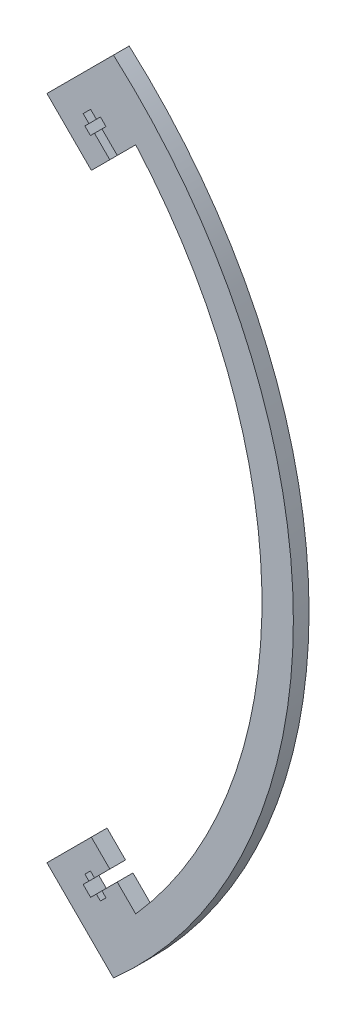
ISO-10303-21;
HEADER;
FILE_DESCRIPTION(('STEP AP214'),'2;1');
FILE_NAME('part.step','',(''),(''),'','','');
FILE_SCHEMA(('AUTOMOTIVE_DESIGN { 1 0 10303 214 1 1 1 1 }'));
ENDSEC;
DATA;
#1=APPLICATION_CONTEXT('core data for automotive mechanical design processes');
#2=APPLICATION_PROTOCOL_DEFINITION('international standard','automotive_design',2000,#1);
#3=PRODUCT_CONTEXT('',#1,'mechanical');
#4=PRODUCT('Part','Part','',(#3));
#5=PRODUCT_RELATED_PRODUCT_CATEGORY('part','',(#4));
#6=PRODUCT_DEFINITION_FORMATION('','',#4);
#7=PRODUCT_DEFINITION_CONTEXT('part definition',#1,'design');
#8=PRODUCT_DEFINITION('design','',#6,#7);
#9=PRODUCT_DEFINITION_SHAPE('','',#8);
#10=(LENGTH_UNIT() NAMED_UNIT(*) SI_UNIT(.MILLI.,.METRE.));
#11=(NAMED_UNIT(*) PLANE_ANGLE_UNIT() SI_UNIT($,.RADIAN.));
#12=(NAMED_UNIT(*) SI_UNIT($,.STERADIAN.) SOLID_ANGLE_UNIT());
#13=UNCERTAINTY_MEASURE_WITH_UNIT(LENGTH_MEASURE(1.E-05),#10,'distance_accuracy_value','');
#14=(GEOMETRIC_REPRESENTATION_CONTEXT(3) GLOBAL_UNCERTAINTY_ASSIGNED_CONTEXT((#13)) GLOBAL_UNIT_ASSIGNED_CONTEXT((#10,
#11,#12)) REPRESENTATION_CONTEXT('',''));
#15=CARTESIAN_POINT('',(0.,0.,0.));
#16=DIRECTION('',(0.,0.,1.));
#17=DIRECTION('',(1.,0.,0.));
#18=AXIS2_PLACEMENT_3D('',#15,#16,#17);
#19=CARTESIAN_POINT('',(-13.2205464738355,-30.6813833004375,-66.4915305198155));
#20=DIRECTION('',(-0.707106781186552,0.707106781186543,0.));
#21=DIRECTION('',(-0.707106781186543,-0.707106781186552,0.));
#22=AXIS2_PLACEMENT_3D('',#19,#20,#21);
#23=PLANE('',#22);
#24=DIRECTION('',(0.,0.,1.));
#25=VECTOR('',#24,1.);
#26=CARTESIAN_POINT('',(122.73431920871,105.273482382109,0.));
#27=LINE('',#26,#25);
#28=CARTESIAN_POINT('',(122.73431920871,105.273482382109,0.));
#29=VERTEX_POINT('',#28);
#30=CARTESIAN_POINT('',(122.73431920871,105.273482382109,6.35));
#31=VERTEX_POINT('',#30);
#32=EDGE_CURVE('E261',#29,#31,#27,.T.);
#33=ORIENTED_EDGE('',*,*,#32,.F.);
#34=DIRECTION('',(-0.707106781186543,-0.707106781186552,0.));
#35=VECTOR('',#34,1.);
#36=CARTESIAN_POINT('',(-13.2205464738355,-30.6813833004375,0.));
#37=LINE('',#36,#35);
#38=CARTESIAN_POINT('',(130.198070847377,112.737234020776,0.));
#39=VERTEX_POINT('',#38);
#40=EDGE_CURVE('E267',#39,#29,#37,.T.);
#41=ORIENTED_EDGE('',*,*,#40,.F.);
#42=DIRECTION('',(0.,0.,1.));
#43=VECTOR('',#42,1.);
#44=CARTESIAN_POINT('',(130.198070847377,112.737234020777,-66.4915305198155));
#45=LINE('',#44,#43);
#46=CARTESIAN_POINT('',(130.198070847377,112.737234020777,6.35));
#47=VERTEX_POINT('',#46);
#48=EDGE_CURVE('E350',#39,#47,#45,.T.);
#49=ORIENTED_EDGE('',*,*,#48,.T.);
#50=DIRECTION('',(-0.707106781186543,-0.707106781186552,0.));
#51=VECTOR('',#50,1.);
#52=CARTESIAN_POINT('',(-13.2205464738355,-30.6813833004375,6.35));
#53=LINE('',#52,#51);
#54=EDGE_CURVE('E342',#47,#31,#53,.T.);
#55=ORIENTED_EDGE('',*,*,#54,.T.);
#56=EDGE_LOOP('',(#33,#41,#49,#55));
#57=FACE_BOUND('',#56,.T.);
#58=ADVANCED_FACE('F35',(#57),#23,.F.);
#59=CARTESIAN_POINT('',(-13.2205464738356,-13.2205464738356,-66.4915305198155));
#60=DIRECTION('',(0.707106781186547,0.707106781186547,0.));
#61=DIRECTION('',(-0.707106781186548,0.707106781186548,0.));
#62=AXIS2_PLACEMENT_3D('',#59,#60,#61);
#63=PLANE('',#62);
#64=DIRECTION('',(-0.707106781186548,0.707106781186548,0.));
#65=VECTOR('',#64,1.);
#66=CARTESIAN_POINT('',(-13.2205464738356,-13.2205464738356,6.35));
#67=LINE('',#66,#65);
#68=CARTESIAN_POINT('',(119.716953152031,-146.158046099702,6.35));
#69=VERTEX_POINT('',#68);
#70=CARTESIAN_POINT('',(112.253201513364,-138.694294461035,6.35));
#71=VERTEX_POINT('',#70);
#72=EDGE_CURVE('E432',#69,#71,#67,.T.);
#73=ORIENTED_EDGE('',*,*,#72,.F.);
#74=DIRECTION('',(0.,0.,1.));
#75=VECTOR('',#74,1.);
#76=CARTESIAN_POINT('',(119.716953152031,-146.158046099702,0.));
#77=LINE('',#76,#75);
#78=CARTESIAN_POINT('',(119.716953152031,-146.158046099702,0.));
#79=VERTEX_POINT('',#78);
#80=EDGE_CURVE('E398',#79,#69,#77,.T.);
#81=ORIENTED_EDGE('',*,*,#80,.F.);
#82=DIRECTION('',(-0.707106781186548,0.707106781186548,0.));
#83=VECTOR('',#82,1.);
#84=CARTESIAN_POINT('',(-13.2205464738356,-13.2205464738356,0.));
#85=LINE('',#84,#83);
#86=CARTESIAN_POINT('',(112.253201513364,-138.694294461035,0.));
#87=VERTEX_POINT('',#86);
#88=EDGE_CURVE('E476',#79,#87,#85,.T.);
#89=ORIENTED_EDGE('',*,*,#88,.T.);
#90=DIRECTION('',(0.,0.,1.));
#91=VECTOR('',#90,1.);
#92=CARTESIAN_POINT('',(112.253201513364,-138.694294461035,-66.4915305198155));
#93=LINE('',#92,#91);
#94=EDGE_CURVE('E472',#87,#71,#93,.T.);
#95=ORIENTED_EDGE('',*,*,#94,.T.);
#96=EDGE_LOOP('',(#73,#81,#89,#95));
#97=FACE_BOUND('',#96,.T.);
#98=ADVANCED_FACE('F568',(#97),#63,.T.);
#99=CARTESIAN_POINT('',(-21.9509648871366,-21.9509648871358,6.35));
#100=DIRECTION('',(0.,0.,-1.));
#101=DIRECTION('',(-1.,0.,0.));
#102=AXIS2_PLACEMENT_3D('',#99,#100,#101);
#103=CYLINDRICAL_SURFACE('',#102,215.9);
#104=CARTESIAN_POINT('',(-21.9509648871366,-21.9509648871358,0.));
#105=DIRECTION('',(0.,0.,1.));
#106=DIRECTION('',(-1.,0.,0.));
#107=AXIS2_PLACEMENT_3D('',#104,#105,#106);
#108=CIRCLE('',#107,215.9);
#109=CARTESIAN_POINT('',(121.204013938505,-183.566131370452,0.));
#110=VERTEX_POINT('',#109);
#111=CARTESIAN_POINT('',(121.204013938504,139.66420159618,0.));
#112=VERTEX_POINT('',#111);
#113=EDGE_CURVE('E479',#110,#112,#108,.T.);
#114=ORIENTED_EDGE('',*,*,#113,.T.);
#115=DIRECTION('',(0.,0.,1.));
#116=VECTOR('',#115,1.);
#117=CARTESIAN_POINT('',(121.204013938504,139.66420159618,-66.4915305198155));
#118=LINE('',#117,#116);
#119=CARTESIAN_POINT('',(121.204013938504,139.66420159618,6.35));
#120=VERTEX_POINT('',#119);
#121=EDGE_CURVE('E362',#112,#120,#118,.T.);
#122=ORIENTED_EDGE('',*,*,#121,.T.);
#123=CARTESIAN_POINT('',(-21.9509648871366,-21.9509648871358,6.35));
#124=DIRECTION('',(0.,0.,1.));
#125=DIRECTION('',(-1.,0.,0.));
#126=AXIS2_PLACEMENT_3D('',#123,#124,#125);
#127=CIRCLE('',#126,215.9);
#128=CARTESIAN_POINT('',(121.204013938505,-183.566131370452,6.35));
#129=VERTEX_POINT('',#128);
#130=EDGE_CURVE('E44',#129,#120,#127,.T.);
#131=ORIENTED_EDGE('',*,*,#130,.F.);
#132=DIRECTION('',(0.,0.,1.));
#133=VECTOR('',#132,1.);
#134=CARTESIAN_POINT('',(121.204013938505,-183.566131370452,-66.4915305198155));
#135=LINE('',#134,#133);
#136=EDGE_CURVE('E467',#110,#129,#135,.T.);
#137=ORIENTED_EDGE('',*,*,#136,.F.);
#138=EDGE_LOOP('',(#114,#122,#131,#137));
#139=FACE_BOUND('',#138,.T.);
#140=ADVANCED_FACE('F37',(#139),#103,.T.);
#141=CARTESIAN_POINT('',(-21.9509648871366,-21.9509648871358,6.35));
#142=DIRECTION('',(0.,0.,-1.));
#143=DIRECTION('',(-1.,0.,0.));
#144=AXIS2_PLACEMENT_3D('',#141,#142,#143);
#145=CYLINDRICAL_SURFACE('',#144,203.2);
#146=CARTESIAN_POINT('',(-21.9509648871366,-21.9509648871358,0.));
#147=DIRECTION('',(0.,0.,-1.));
#148=DIRECTION('',(-1.,0.,0.));
#149=AXIS2_PLACEMENT_3D('',#146,#147,#148);
#150=CIRCLE('',#149,203.2);
#151=CARTESIAN_POINT('',(130.198070847378,-156.639163795049,0.));
#152=VERTEX_POINT('',#151);
#153=EDGE_CURVE('E39',#39,#152,#150,.T.);
#154=ORIENTED_EDGE('',*,*,#153,.T.);
#155=DIRECTION('',(0.,0.,1.));
#156=VECTOR('',#155,1.);
#157=CARTESIAN_POINT('',(130.198070847378,-156.639163795049,-66.4915305198155));
#158=LINE('',#157,#156);
#159=CARTESIAN_POINT('',(130.198070847378,-156.639163795049,6.35));
#160=VERTEX_POINT('',#159);
#161=EDGE_CURVE('E457',#152,#160,#158,.T.);
#162=ORIENTED_EDGE('',*,*,#161,.T.);
#163=CARTESIAN_POINT('',(-21.9509648871366,-21.9509648871358,6.35));
#164=DIRECTION('',(0.,0.,-1.));
#165=DIRECTION('',(-1.,0.,0.));
#166=AXIS2_PLACEMENT_3D('',#163,#164,#165);
#167=CIRCLE('',#166,203.2);
#168=EDGE_CURVE('E11',#47,#160,#167,.T.);
#169=ORIENTED_EDGE('',*,*,#168,.F.);
#170=ORIENTED_EDGE('',*,*,#48,.F.);
#171=EDGE_LOOP('',(#154,#162,#169,#170));
#172=FACE_BOUND('',#171,.T.);
#173=ADVANCED_FACE('F490',(#172),#145,.F.);
#174=CARTESIAN_POINT('',(-21.9509648871366,-21.9509648871358,6.35));
#175=DIRECTION('',(0.,0.,-1.));
#176=DIRECTION('',(-1.,0.,0.));
#177=AXIS2_PLACEMENT_3D('',#174,#175,#176);
#178=PLANE('',#177);
#179=CARTESIAN_POINT('',(119.716953152031,102.25611632543,6.35));
#180=VERTEX_POINT('',#179);
#181=CARTESIAN_POINT('',(112.253201513363,94.792364686763,6.35));
#182=VERTEX_POINT('',#181);
#183=EDGE_CURVE('E346',#180,#182,#53,.T.);
#184=ORIENTED_EDGE('',*,*,#183,.F.);
#185=DIRECTION('',(0.707106781186552,-0.707106781186543,0.));
#186=VECTOR('',#185,1.);
#187=CARTESIAN_POINT('',(132.937499625866,89.0355698515946,6.35));
#188=LINE('',#187,#186);
#189=CARTESIAN_POINT('',(113.520576428493,108.452493048968,6.35));
#190=VERTEX_POINT('',#189);
#191=EDGE_CURVE('E268',#190,#180,#188,.T.);
#192=ORIENTED_EDGE('',*,*,#191,.F.);
#193=DIRECTION('',(0.707106781186543,0.707106781186552,0.));
#194=VECTOR('',#193,1.);
#195=CARTESIAN_POINT('',(-19.4169231973732,-24.4850065768999,6.35));
#196=LINE('',#195,#194);
#197=CARTESIAN_POINT('',(111.886169814458,106.818086434933,6.35));
#198=VERTEX_POINT('',#197);
#199=EDGE_CURVE('E270',#198,#190,#196,.T.);
#200=ORIENTED_EDGE('',*,*,#199,.F.);
#201=DIRECTION('',(0.707106781186552,-0.707106781186543,0.));
#202=VECTOR('',#201,1.);
#203=CARTESIAN_POINT('',(131.303093011832,87.40116323756,6.35));
#204=LINE('',#203,#202);
#205=CARTESIAN_POINT('',(109.641105784191,109.0631504652,6.35));
#206=VERTEX_POINT('',#205);
#207=EDGE_CURVE('E315',#206,#198,#204,.T.);
#208=ORIENTED_EDGE('',*,*,#207,.F.);
#209=DIRECTION('',(-0.707106781186543,-0.707106781186552,0.));
#210=VECTOR('',#209,1.);
#211=CARTESIAN_POINT('',(-21.6619872276405,-22.2399425466326,6.35));
#212=LINE('',#211,#210);
#213=CARTESIAN_POINT('',(111.275512398225,110.697557079235,6.35));
#214=VERTEX_POINT('',#213);
#215=EDGE_CURVE('E312',#214,#206,#212,.T.);
#216=ORIENTED_EDGE('',*,*,#215,.F.);
#217=DIRECTION('',(-0.707106781186552,0.707106781186543,0.));
#218=VECTOR('',#217,1.);
#219=CARTESIAN_POINT('',(132.937499625866,89.0355698515946,6.35));
#220=LINE('',#219,#218);
#221=CARTESIAN_POINT('',(108.940645806747,113.032423670713,6.35));
#222=VERTEX_POINT('',#221);
#223=EDGE_CURVE('E309',#214,#222,#220,.T.);
#224=ORIENTED_EDGE('',*,*,#223,.T.);
#225=DIRECTION('',(0.707106781186543,0.707106781186552,0.));
#226=VECTOR('',#225,1.);
#227=CARTESIAN_POINT('',(-23.9968538191185,-19.9050759551546,6.35));
#228=LINE('',#227,#226);
#229=CARTESIAN_POINT('',(111.958011863427,116.049789727392,6.35));
#230=VERTEX_POINT('',#229);
#231=EDGE_CURVE('E306',#222,#230,#228,.T.);
#232=ORIENTED_EDGE('',*,*,#231,.T.);
#233=DIRECTION('',(-0.707106781186552,0.707106781186543,0.));
#234=VECTOR('',#233,1.);
#235=CARTESIAN_POINT('',(135.954865682545,92.0529359082739,6.35));
#236=LINE('',#235,#234);
#237=CARTESIAN_POINT('',(114.292878454905,113.714923135914,6.35));
#238=VERTEX_POINT('',#237);
#239=EDGE_CURVE('E303',#238,#230,#236,.T.);
#240=ORIENTED_EDGE('',*,*,#239,.F.);
#241=DIRECTION('',(0.70710678118654,0.707106781186555,0.));
#242=VECTOR('',#241,1.);
#243=CARTESIAN_POINT('',(-21.66198722764,-22.2399425466332,6.35));
#244=LINE('',#243,#242);
#245=CARTESIAN_POINT('',(115.927285068939,115.349329749949,6.35));
#246=VERTEX_POINT('',#245);
#247=EDGE_CURVE('E300',#238,#246,#244,.T.);
#248=ORIENTED_EDGE('',*,*,#247,.T.);
#249=DIRECTION('',(0.707106781186545,-0.70710678118655,0.));
#250=VECTOR('',#249,1.);
#251=CARTESIAN_POINT('',(137.589272296581,93.687342522307,6.35));
#252=LINE('',#251,#250);
#253=CARTESIAN_POINT('',(118.172349099207,113.104265719682,6.35));
#254=VERTEX_POINT('',#253);
#255=EDGE_CURVE('E297',#246,#254,#252,.T.);
#256=ORIENTED_EDGE('',*,*,#255,.T.);
#257=DIRECTION('',(-0.707106781186543,-0.707106781186552,0.));
#258=VECTOR('',#257,1.);
#259=CARTESIAN_POINT('',(-19.4169231973732,-24.4850065768999,6.35));
#260=LINE('',#259,#258);
#261=CARTESIAN_POINT('',(116.537942485172,111.469859105647,6.35));
#262=VERTEX_POINT('',#261);
#263=EDGE_CURVE('E295',#254,#262,#260,.T.);
#264=ORIENTED_EDGE('',*,*,#263,.T.);
#265=DIRECTION('',(0.707106781186552,-0.707106781186543,0.));
#266=VECTOR('',#265,1.);
#267=CARTESIAN_POINT('',(135.954865682545,92.0529359082739,6.35));
#268=LINE('',#267,#266);
#269=EDGE_CURVE('E259',#262,#31,#268,.T.);
#270=ORIENTED_EDGE('',*,*,#269,.T.);
#271=ORIENTED_EDGE('',*,*,#54,.F.);
#272=ORIENTED_EDGE('',*,*,#168,.T.);
#273=CARTESIAN_POINT('',(122.73431920871,-149.175412156382,6.35));
#274=VERTEX_POINT('',#273);
#275=EDGE_CURVE('E461',#160,#274,#67,.T.);
#276=ORIENTED_EDGE('',*,*,#275,.T.);
#277=DIRECTION('',(0.707106781186548,0.707106781186548,0.));
#278=VECTOR('',#277,1.);
#279=CARTESIAN_POINT('',(135.954865682546,-135.954865682546,6.35));
#280=LINE('',#279,#278);
#281=CARTESIAN_POINT('',(116.537942485173,-155.371788879919,6.35));
#282=VERTEX_POINT('',#281);
#283=EDGE_CURVE('E372',#282,#274,#280,.T.);
#284=ORIENTED_EDGE('',*,*,#283,.F.);
#285=DIRECTION('',(-0.707106781186548,0.707106781186548,0.));
#286=VECTOR('',#285,1.);
#287=CARTESIAN_POINT('',(-19.4169231973732,-19.4169231973732,6.35));
#288=LINE('',#287,#286);
#289=CARTESIAN_POINT('',(118.172349099207,-157.006195493954,6.35));
#290=VERTEX_POINT('',#289);
#291=EDGE_CURVE('E425',#290,#282,#288,.T.);
#292=ORIENTED_EDGE('',*,*,#291,.F.);
#293=DIRECTION('',(0.707106781186541,0.707106781186554,0.));
#294=VECTOR('',#293,1.);
#295=CARTESIAN_POINT('',(137.589272296582,-137.589272296579,6.35));
#296=LINE('',#295,#294);
#297=CARTESIAN_POINT('',(115.92728506894,-159.251259524221,6.35));
#298=VERTEX_POINT('',#297);
#299=EDGE_CURVE('E422',#298,#290,#296,.T.);
#300=ORIENTED_EDGE('',*,*,#299,.F.);
#301=DIRECTION('',(0.707106781186545,-0.707106781186551,0.));
#302=VECTOR('',#301,1.);
#303=CARTESIAN_POINT('',(-21.66198722764,-21.6619872276399,6.35));
#304=LINE('',#303,#302);
#305=CARTESIAN_POINT('',(114.292878454905,-157.616852910187,6.35));
#306=VERTEX_POINT('',#305);
#307=EDGE_CURVE('E419',#306,#298,#304,.T.);
#308=ORIENTED_EDGE('',*,*,#307,.F.);
#309=DIRECTION('',(-0.707106781186548,-0.707106781186548,0.));
#310=VECTOR('',#309,1.);
#311=CARTESIAN_POINT('',(135.954865682546,-135.954865682546,6.35));
#312=LINE('',#311,#310);
#313=CARTESIAN_POINT('',(111.958011863428,-159.951719501664,6.35));
#314=VERTEX_POINT('',#313);
#315=EDGE_CURVE('E416',#306,#314,#312,.T.);
#316=ORIENTED_EDGE('',*,*,#315,.T.);
#317=DIRECTION('',(0.707106781186548,-0.707106781186548,0.));
#318=VECTOR('',#317,1.);
#319=CARTESIAN_POINT('',(-23.9968538191185,-23.9968538191185,6.35));
#320=LINE('',#319,#318);
#321=CARTESIAN_POINT('',(108.940645806748,-156.934353444985,6.35));
#322=VERTEX_POINT('',#321);
#323=EDGE_CURVE('E413',#322,#314,#320,.T.);
#324=ORIENTED_EDGE('',*,*,#323,.F.);
#325=DIRECTION('',(-0.707106781186548,-0.707106781186548,0.));
#326=VECTOR('',#325,1.);
#327=CARTESIAN_POINT('',(132.937499625867,-132.937499625867,6.35));
#328=LINE('',#327,#326);
#329=CARTESIAN_POINT('',(111.275512398226,-154.599486853507,6.35));
#330=VERTEX_POINT('',#329);
#331=EDGE_CURVE('E410',#330,#322,#328,.T.);
#332=ORIENTED_EDGE('',*,*,#331,.F.);
#333=DIRECTION('',(-0.707106781186548,0.707106781186548,0.));
#334=VECTOR('',#333,1.);
#335=CARTESIAN_POINT('',(-21.6619872276405,-21.6619872276405,6.35));
#336=LINE('',#335,#334);
#337=CARTESIAN_POINT('',(109.641105784192,-152.965080239473,6.35));
#338=VERTEX_POINT('',#337);
#339=EDGE_CURVE('E407',#330,#338,#336,.T.);
#340=ORIENTED_EDGE('',*,*,#339,.T.);
#341=DIRECTION('',(0.707106781186548,0.707106781186548,0.));
#342=VECTOR('',#341,1.);
#343=CARTESIAN_POINT('',(131.303093011832,-131.303093011832,6.35));
#344=LINE('',#343,#342);
#345=CARTESIAN_POINT('',(111.886169814459,-150.720016209205,6.35));
#346=VERTEX_POINT('',#345);
#347=EDGE_CURVE('E404',#338,#346,#344,.T.);
#348=ORIENTED_EDGE('',*,*,#347,.T.);
#349=DIRECTION('',(0.707106781186548,-0.707106781186548,0.));
#350=VECTOR('',#349,1.);
#351=CARTESIAN_POINT('',(-19.4169231973732,-19.4169231973732,6.35));
#352=LINE('',#351,#350);
#353=CARTESIAN_POINT('',(113.520576428494,-152.35442282324,6.35));
#354=VERTEX_POINT('',#353);
#355=EDGE_CURVE('E401',#346,#354,#352,.T.);
#356=ORIENTED_EDGE('',*,*,#355,.T.);
#357=DIRECTION('',(0.707106781186548,0.707106781186548,0.));
#358=VECTOR('',#357,1.);
#359=CARTESIAN_POINT('',(132.937499625867,-132.937499625867,6.35));
#360=LINE('',#359,#358);
#361=EDGE_CURVE('E345',#354,#69,#360,.T.);
#362=ORIENTED_EDGE('',*,*,#361,.T.);
#363=ORIENTED_EDGE('',*,*,#72,.T.);
#364=DIRECTION('',(-0.707106781186548,-0.707106781186547,0.));
#365=VECTOR('',#364,1.);
#366=CARTESIAN_POINT('',(125.4737479872,-125.4737479872,6.35));
#367=LINE('',#366,#365);
#368=CARTESIAN_POINT('',(94.2926892712258,-156.654806703174,6.35));
#369=VERTEX_POINT('',#368);
#370=EDGE_CURVE('E458',#71,#369,#367,.T.);
#371=ORIENTED_EDGE('',*,*,#370,.T.);
#372=DIRECTION('',(0.707106781186548,-0.707106781186547,0.));
#373=VECTOR('',#372,1.);
#374=CARTESIAN_POINT('',(-31.1810587159739,-31.1810587159739,6.35));
#375=LINE('',#374,#373);
#376=EDGE_CURVE('E454',#369,#129,#375,.T.);
#377=ORIENTED_EDGE('',*,*,#376,.T.);
#378=ORIENTED_EDGE('',*,*,#130,.T.);
#379=DIRECTION('',(0.707106781186544,0.707106781186552,0.));
#380=VECTOR('',#379,1.);
#381=CARTESIAN_POINT('',(-31.181058715974,-12.7208710582992,6.35));
#382=LINE('',#381,#380);
#383=CARTESIAN_POINT('',(94.292689271225,112.752876928901,6.35));
#384=VERTEX_POINT('',#383);
#385=EDGE_CURVE('E352',#384,#120,#382,.T.);
#386=ORIENTED_EDGE('',*,*,#385,.F.);
#387=DIRECTION('',(-0.707106781186552,0.707106781186543,0.));
#388=VECTOR('',#387,1.);
#389=CARTESIAN_POINT('',(125.473747987199,81.5718182129276,6.35));
#390=LINE('',#389,#388);
#391=EDGE_CURVE('E347',#182,#384,#390,.T.);
#392=ORIENTED_EDGE('',*,*,#391,.F.);
#393=EDGE_LOOP('',(#184,#192,#200,#208,#216,#224,#232,#240,#248,#256,#264,#270,#271,#272,#276,
#284,#292,#300,#308,#316,#324,#332,#340,#348,#356,#362,#363,#371,#377,#378,#386,#392));
#394=FACE_BOUND('',#393,.T.);
#395=ADVANCED_FACE('F499',(#394),#178,.F.);
#396=CARTESIAN_POINT('',(-21.9509648871366,-21.9509648871358,0.));
#397=DIRECTION('',(0.,0.,-1.));
#398=DIRECTION('',(-1.,0.,0.));
#399=AXIS2_PLACEMENT_3D('',#396,#397,#398);
#400=PLANE('',#399);
#401=DIRECTION('',(0.707106781186552,-0.707106781186543,0.));
#402=VECTOR('',#401,1.);
#403=CARTESIAN_POINT('',(132.937499625866,89.0355698515946,0.));
#404=LINE('',#403,#402);
#405=CARTESIAN_POINT('',(113.520576428493,108.452493048968,0.));
#406=VERTEX_POINT('',#405);
#407=CARTESIAN_POINT('',(119.716953152031,102.25611632543,0.));
#408=VERTEX_POINT('',#407);
#409=EDGE_CURVE('E292',#406,#408,#404,.T.);
#410=ORIENTED_EDGE('',*,*,#409,.T.);
#411=CARTESIAN_POINT('',(112.253201513363,94.792364686763,0.));
#412=VERTEX_POINT('',#411);
#413=EDGE_CURVE('E323',#408,#412,#37,.T.);
#414=ORIENTED_EDGE('',*,*,#413,.T.);
#415=DIRECTION('',(-0.707106781186552,0.707106781186543,0.));
#416=VECTOR('',#415,1.);
#417=CARTESIAN_POINT('',(125.473747987199,81.5718182129276,0.));
#418=LINE('',#417,#416);
#419=CARTESIAN_POINT('',(94.292689271225,112.752876928901,0.));
#420=VERTEX_POINT('',#419);
#421=EDGE_CURVE('E357',#412,#420,#418,.T.);
#422=ORIENTED_EDGE('',*,*,#421,.T.);
#423=DIRECTION('',(0.707106781186544,0.707106781186552,0.));
#424=VECTOR('',#423,1.);
#425=CARTESIAN_POINT('',(-31.181058715974,-12.7208710582992,0.));
#426=LINE('',#425,#424);
#427=EDGE_CURVE('E359',#420,#112,#426,.T.);
#428=ORIENTED_EDGE('',*,*,#427,.T.);
#429=ORIENTED_EDGE('',*,*,#113,.F.);
#430=DIRECTION('',(0.707106781186548,-0.707106781186547,0.));
#431=VECTOR('',#430,1.);
#432=CARTESIAN_POINT('',(-31.1810587159739,-31.1810587159739,0.));
#433=LINE('',#432,#431);
#434=CARTESIAN_POINT('',(94.2926892712258,-156.654806703174,0.));
#435=VERTEX_POINT('',#434);
#436=EDGE_CURVE('E464',#435,#110,#433,.T.);
#437=ORIENTED_EDGE('',*,*,#436,.F.);
#438=DIRECTION('',(-0.707106781186548,-0.707106781186547,0.));
#439=VECTOR('',#438,1.);
#440=CARTESIAN_POINT('',(125.4737479872,-125.4737479872,0.));
#441=LINE('',#440,#439);
#442=EDGE_CURVE('E469',#87,#435,#441,.T.);
#443=ORIENTED_EDGE('',*,*,#442,.F.);
#444=ORIENTED_EDGE('',*,*,#88,.F.);
#445=DIRECTION('',(0.707106781186548,0.707106781186548,0.));
#446=VECTOR('',#445,1.);
#447=CARTESIAN_POINT('',(132.937499625867,-132.937499625867,0.));
#448=LINE('',#447,#446);
#449=CARTESIAN_POINT('',(113.520576428494,-152.35442282324,0.));
#450=VERTEX_POINT('',#449);
#451=EDGE_CURVE('E60',#450,#79,#448,.T.);
#452=ORIENTED_EDGE('',*,*,#451,.F.);
#453=DIRECTION('',(0.707106781186548,-0.707106781186548,0.));
#454=VECTOR('',#453,1.);
#455=CARTESIAN_POINT('',(-19.4169231973732,-19.4169231973732,0.));
#456=LINE('',#455,#454);
#457=CARTESIAN_POINT('',(111.886169814459,-150.720016209205,0.));
#458=VERTEX_POINT('',#457);
#459=EDGE_CURVE('E371',#458,#450,#456,.T.);
#460=ORIENTED_EDGE('',*,*,#459,.F.);
#461=DIRECTION('',(0.707106781186548,0.707106781186548,0.));
#462=VECTOR('',#461,1.);
#463=CARTESIAN_POINT('',(131.303093011832,-131.303093011832,0.));
#464=LINE('',#463,#462);
#465=CARTESIAN_POINT('',(109.641105784192,-152.965080239473,0.));
#466=VERTEX_POINT('',#465);
#467=EDGE_CURVE('E374',#466,#458,#464,.T.);
#468=ORIENTED_EDGE('',*,*,#467,.F.);
#469=DIRECTION('',(-0.707106781186548,0.707106781186548,0.));
#470=VECTOR('',#469,1.);
#471=CARTESIAN_POINT('',(-21.6619872276405,-21.6619872276405,0.));
#472=LINE('',#471,#470);
#473=CARTESIAN_POINT('',(111.275512398226,-154.599486853507,0.));
#474=VERTEX_POINT('',#473);
#475=EDGE_CURVE('E376',#474,#466,#472,.T.);
#476=ORIENTED_EDGE('',*,*,#475,.F.);
#477=DIRECTION('',(-0.707106781186548,-0.707106781186548,0.));
#478=VECTOR('',#477,1.);
#479=CARTESIAN_POINT('',(132.937499625867,-132.937499625867,0.));
#480=LINE('',#479,#478);
#481=CARTESIAN_POINT('',(108.940645806748,-156.934353444985,0.));
#482=VERTEX_POINT('',#481);
#483=EDGE_CURVE('E378',#474,#482,#480,.T.);
#484=ORIENTED_EDGE('',*,*,#483,.T.);
#485=DIRECTION('',(0.707106781186548,-0.707106781186548,0.));
#486=VECTOR('',#485,1.);
#487=CARTESIAN_POINT('',(-23.9968538191185,-23.9968538191185,0.));
#488=LINE('',#487,#486);
#489=CARTESIAN_POINT('',(111.958011863428,-159.951719501664,0.));
#490=VERTEX_POINT('',#489);
#491=EDGE_CURVE('E381',#482,#490,#488,.T.);
#492=ORIENTED_EDGE('',*,*,#491,.T.);
#493=DIRECTION('',(-0.707106781186548,-0.707106781186548,0.));
#494=VECTOR('',#493,1.);
#495=CARTESIAN_POINT('',(135.954865682546,-135.954865682546,0.));
#496=LINE('',#495,#494);
#497=CARTESIAN_POINT('',(114.292878454905,-157.616852910187,0.));
#498=VERTEX_POINT('',#497);
#499=EDGE_CURVE('E384',#498,#490,#496,.T.);
#500=ORIENTED_EDGE('',*,*,#499,.F.);
#501=DIRECTION('',(0.707106781186545,-0.707106781186551,0.));
#502=VECTOR('',#501,1.);
#503=CARTESIAN_POINT('',(-21.66198722764,-21.6619872276399,0.));
#504=LINE('',#503,#502);
#505=CARTESIAN_POINT('',(115.92728506894,-159.251259524221,0.));
#506=VERTEX_POINT('',#505);
#507=EDGE_CURVE('E386',#498,#506,#504,.T.);
#508=ORIENTED_EDGE('',*,*,#507,.T.);
#509=DIRECTION('',(0.707106781186541,0.707106781186554,0.));
#510=VECTOR('',#509,1.);
#511=CARTESIAN_POINT('',(137.589272296582,-137.589272296579,0.));
#512=LINE('',#511,#510);
#513=CARTESIAN_POINT('',(118.172349099207,-157.006195493954,0.));
#514=VERTEX_POINT('',#513);
#515=EDGE_CURVE('E389',#506,#514,#512,.T.);
#516=ORIENTED_EDGE('',*,*,#515,.T.);
#517=DIRECTION('',(-0.707106781186548,0.707106781186548,0.));
#518=VECTOR('',#517,1.);
#519=CARTESIAN_POINT('',(-19.4169231973732,-19.4169231973732,0.));
#520=LINE('',#519,#518);
#521=CARTESIAN_POINT('',(116.537942485173,-155.371788879919,0.));
#522=VERTEX_POINT('',#521);
#523=EDGE_CURVE('E392',#514,#522,#520,.T.);
#524=ORIENTED_EDGE('',*,*,#523,.T.);
#525=DIRECTION('',(0.707106781186548,0.707106781186548,0.));
#526=VECTOR('',#525,1.);
#527=CARTESIAN_POINT('',(135.954865682546,-135.954865682546,0.));
#528=LINE('',#527,#526);
#529=CARTESIAN_POINT('',(122.73431920871,-149.175412156382,0.));
#530=VERTEX_POINT('',#529);
#531=EDGE_CURVE('E395',#522,#530,#528,.T.);
#532=ORIENTED_EDGE('',*,*,#531,.T.);
#533=EDGE_CURVE('E473',#152,#530,#85,.T.);
#534=ORIENTED_EDGE('',*,*,#533,.F.);
#535=ORIENTED_EDGE('',*,*,#153,.F.);
#536=ORIENTED_EDGE('',*,*,#40,.T.);
#537=DIRECTION('',(0.707106781186552,-0.707106781186543,0.));
#538=VECTOR('',#537,1.);
#539=CARTESIAN_POINT('',(135.954865682545,92.0529359082739,0.));
#540=LINE('',#539,#538);
#541=CARTESIAN_POINT('',(116.537942485172,111.469859105647,0.));
#542=VERTEX_POINT('',#541);
#543=EDGE_CURVE('E52',#542,#29,#540,.T.);
#544=ORIENTED_EDGE('',*,*,#543,.F.);
#545=DIRECTION('',(-0.707106781186543,-0.707106781186552,0.));
#546=VECTOR('',#545,1.);
#547=CARTESIAN_POINT('',(-19.4169231973732,-24.4850065768999,0.));
#548=LINE('',#547,#546);
#549=CARTESIAN_POINT('',(118.172349099207,113.104265719682,0.));
#550=VERTEX_POINT('',#549);
#551=EDGE_CURVE('E247',#550,#542,#548,.T.);
#552=ORIENTED_EDGE('',*,*,#551,.F.);
#553=DIRECTION('',(0.707106781186545,-0.70710678118655,0.));
#554=VECTOR('',#553,1.);
#555=CARTESIAN_POINT('',(137.589272296581,93.687342522307,0.));
#556=LINE('',#555,#554);
#557=CARTESIAN_POINT('',(115.927285068939,115.349329749949,0.));
#558=VERTEX_POINT('',#557);
#559=EDGE_CURVE('E255',#558,#550,#556,.T.);
#560=ORIENTED_EDGE('',*,*,#559,.F.);
#561=DIRECTION('',(0.70710678118654,0.707106781186555,0.));
#562=VECTOR('',#561,1.);
#563=CARTESIAN_POINT('',(-21.66198722764,-22.2399425466332,0.));
#564=LINE('',#563,#562);
#565=CARTESIAN_POINT('',(114.292878454905,113.714923135914,0.));
#566=VERTEX_POINT('',#565);
#567=EDGE_CURVE('E274',#566,#558,#564,.T.);
#568=ORIENTED_EDGE('',*,*,#567,.F.);
#569=DIRECTION('',(-0.707106781186552,0.707106781186543,0.));
#570=VECTOR('',#569,1.);
#571=CARTESIAN_POINT('',(135.954865682545,92.0529359082739,0.));
#572=LINE('',#571,#570);
#573=CARTESIAN_POINT('',(111.958011863427,116.049789727392,0.));
#574=VERTEX_POINT('',#573);
#575=EDGE_CURVE('E276',#566,#574,#572,.T.);
#576=ORIENTED_EDGE('',*,*,#575,.T.);
#577=DIRECTION('',(0.707106781186543,0.707106781186552,0.));
#578=VECTOR('',#577,1.);
#579=CARTESIAN_POINT('',(-23.9968538191185,-19.9050759551546,0.));
#580=LINE('',#579,#578);
#581=CARTESIAN_POINT('',(108.940645806747,113.032423670713,0.));
#582=VERTEX_POINT('',#581);
#583=EDGE_CURVE('E279',#582,#574,#580,.T.);
#584=ORIENTED_EDGE('',*,*,#583,.F.);
#585=DIRECTION('',(-0.707106781186552,0.707106781186543,0.));
#586=VECTOR('',#585,1.);
#587=CARTESIAN_POINT('',(132.937499625866,89.0355698515946,0.));
#588=LINE('',#587,#586);
#589=CARTESIAN_POINT('',(111.275512398225,110.697557079235,0.));
#590=VERTEX_POINT('',#589);
#591=EDGE_CURVE('E281',#590,#582,#588,.T.);
#592=ORIENTED_EDGE('',*,*,#591,.F.);
#593=DIRECTION('',(-0.707106781186543,-0.707106781186552,0.));
#594=VECTOR('',#593,1.);
#595=CARTESIAN_POINT('',(-21.6619872276405,-22.2399425466326,0.));
#596=LINE('',#595,#594);
#597=CARTESIAN_POINT('',(109.641105784191,109.0631504652,0.));
#598=VERTEX_POINT('',#597);
#599=EDGE_CURVE('E283',#590,#598,#596,.T.);
#600=ORIENTED_EDGE('',*,*,#599,.T.);
#601=DIRECTION('',(0.707106781186552,-0.707106781186543,0.));
#602=VECTOR('',#601,1.);
#603=CARTESIAN_POINT('',(131.303093011832,87.40116323756,0.));
#604=LINE('',#603,#602);
#605=CARTESIAN_POINT('',(111.886169814458,106.818086434933,0.));
#606=VERTEX_POINT('',#605);
#607=EDGE_CURVE('E286',#598,#606,#604,.T.);
#608=ORIENTED_EDGE('',*,*,#607,.T.);
#609=DIRECTION('',(0.707106781186543,0.707106781186552,0.));
#610=VECTOR('',#609,1.);
#611=CARTESIAN_POINT('',(-19.4169231973732,-24.4850065768999,0.));
#612=LINE('',#611,#610);
#613=EDGE_CURVE('E289',#606,#406,#612,.T.);
#614=ORIENTED_EDGE('',*,*,#613,.T.);
#615=EDGE_LOOP('',(#410,#414,#422,#428,#429,#437,#443,#444,#452,#460,#468,#476,#484,#492,#500,
#508,#516,#524,#532,#534,#535,#536,#544,#552,#560,#568,#576,#584,#592,#600,#608,#614));
#616=FACE_BOUND('',#615,.T.);
#617=ADVANCED_FACE('F265',(#616),#400,.T.);
#618=DIRECTION('',(0.,0.,1.));
#619=VECTOR('',#618,1.);
#620=CARTESIAN_POINT('',(122.73431920871,-149.175412156382,0.));
#621=LINE('',#620,#619);
#622=EDGE_CURVE('E429',#530,#274,#621,.T.);
#623=ORIENTED_EDGE('',*,*,#622,.T.);
#624=ORIENTED_EDGE('',*,*,#275,.F.);
#625=ORIENTED_EDGE('',*,*,#161,.F.);
#626=ORIENTED_EDGE('',*,*,#533,.T.);
#627=EDGE_LOOP('',(#623,#624,#625,#626));
#628=FACE_BOUND('',#627,.T.);
#629=ADVANCED_FACE('F495',(#628),#63,.T.);
#630=CARTESIAN_POINT('',(125.4737479872,-125.4737479872,-66.4915305198155));
#631=DIRECTION('',(-0.707106781186547,0.707106781186548,0.));
#632=DIRECTION('',(-0.707106781186548,-0.707106781186547,0.));
#633=AXIS2_PLACEMENT_3D('',#630,#631,#632);
#634=PLANE('',#633);
#635=ORIENTED_EDGE('',*,*,#94,.F.);
#636=ORIENTED_EDGE('',*,*,#442,.T.);
#637=DIRECTION('',(0.,0.,1.));
#638=VECTOR('',#637,1.);
#639=CARTESIAN_POINT('',(94.2926892712258,-156.654806703174,-66.4915305198155));
#640=LINE('',#639,#638);
#641=EDGE_CURVE('E468',#435,#369,#640,.T.);
#642=ORIENTED_EDGE('',*,*,#641,.T.);
#643=ORIENTED_EDGE('',*,*,#370,.F.);
#644=EDGE_LOOP('',(#635,#636,#642,#643));
#645=FACE_BOUND('',#644,.T.);
#646=ADVANCED_FACE('F563',(#645),#634,.T.);
#647=CARTESIAN_POINT('',(-31.1810587159739,-31.1810587159739,-66.4915305198155));
#648=DIRECTION('',(-0.707106781186547,-0.707106781186548,0.));
#649=DIRECTION('',(0.707106781186548,-0.707106781186547,0.));
#650=AXIS2_PLACEMENT_3D('',#647,#648,#649);
#651=PLANE('',#650);
#652=ORIENTED_EDGE('',*,*,#641,.F.);
#653=ORIENTED_EDGE('',*,*,#436,.T.);
#654=ORIENTED_EDGE('',*,*,#136,.T.);
#655=ORIENTED_EDGE('',*,*,#376,.F.);
#656=EDGE_LOOP('',(#652,#653,#654,#655));
#657=FACE_BOUND('',#656,.T.);
#658=ADVANCED_FACE('F558',(#657),#651,.T.);
#659=CARTESIAN_POINT('',(135.954865682546,-135.954865682546,0.));
#660=DIRECTION('',(0.707106781186547,-0.707106781186547,0.));
#661=DIRECTION('',(0.707106781186548,0.707106781186548,0.));
#662=AXIS2_PLACEMENT_3D('',#659,#660,#661);
#663=PLANE('',#662);
#664=ORIENTED_EDGE('',*,*,#283,.T.);
#665=ORIENTED_EDGE('',*,*,#622,.F.);
#666=ORIENTED_EDGE('',*,*,#531,.F.);
#667=DIRECTION('',(0.,0.,1.));
#668=VECTOR('',#667,1.);
#669=CARTESIAN_POINT('',(116.537942485173,-155.371788879919,0.));
#670=LINE('',#669,#668);
#671=EDGE_CURVE('E433',#522,#282,#670,.T.);
#672=ORIENTED_EDGE('',*,*,#671,.T.);
#673=EDGE_LOOP('',(#664,#665,#666,#672));
#674=FACE_BOUND('',#673,.T.);
#675=ADVANCED_FACE('F609',(#674),#663,.F.);
#676=CARTESIAN_POINT('',(-19.4169231973732,-19.4169231973732,0.));
#677=DIRECTION('',(0.707106781186547,0.707106781186547,0.));
#678=DIRECTION('',(-0.707106781186548,0.707106781186548,0.));
#679=AXIS2_PLACEMENT_3D('',#676,#677,#678);
#680=PLANE('',#679);
#681=ORIENTED_EDGE('',*,*,#291,.T.);
#682=ORIENTED_EDGE('',*,*,#671,.F.);
#683=ORIENTED_EDGE('',*,*,#523,.F.);
#684=DIRECTION('',(0.,0.,1.));
#685=VECTOR('',#684,1.);
#686=CARTESIAN_POINT('',(118.172349099207,-157.006195493954,0.));
#687=LINE('',#686,#685);
#688=EDGE_CURVE('E435',#514,#290,#687,.T.);
#689=ORIENTED_EDGE('',*,*,#688,.T.);
#690=EDGE_LOOP('',(#681,#682,#683,#689));
#691=FACE_BOUND('',#690,.T.);
#692=ADVANCED_FACE('F607',(#691),#680,.F.);
#693=CARTESIAN_POINT('',(137.589272296582,-137.589272296579,0.));
#694=DIRECTION('',(0.707106781186554,-0.707106781186541,0.));
#695=DIRECTION('',(0.707106781186541,0.707106781186554,0.));
#696=AXIS2_PLACEMENT_3D('',#693,#694,#695);
#697=PLANE('',#696);
#698=ORIENTED_EDGE('',*,*,#299,.T.);
#699=ORIENTED_EDGE('',*,*,#688,.F.);
#700=ORIENTED_EDGE('',*,*,#515,.F.);
#701=DIRECTION('',(0.,0.,1.));
#702=VECTOR('',#701,1.);
#703=CARTESIAN_POINT('',(115.92728506894,-159.251259524221,0.));
#704=LINE('',#703,#702);
#705=EDGE_CURVE('E437',#506,#298,#704,.T.);
#706=ORIENTED_EDGE('',*,*,#705,.T.);
#707=EDGE_LOOP('',(#698,#699,#700,#706));
#708=FACE_BOUND('',#707,.T.);
#709=ADVANCED_FACE('F604',(#708),#697,.F.);
#710=CARTESIAN_POINT('',(-21.66198722764,-21.6619872276399,0.));
#711=DIRECTION('',(-0.70710678118655,-0.707106781186544,0.));
#712=DIRECTION('',(0.707106781186545,-0.707106781186551,0.));
#713=AXIS2_PLACEMENT_3D('',#710,#711,#712);
#714=PLANE('',#713);
#715=ORIENTED_EDGE('',*,*,#307,.T.);
#716=ORIENTED_EDGE('',*,*,#705,.F.);
#717=ORIENTED_EDGE('',*,*,#507,.F.);
#718=DIRECTION('',(0.,0.,1.));
#719=VECTOR('',#718,1.);
#720=CARTESIAN_POINT('',(114.292878454905,-157.616852910187,0.));
#721=LINE('',#720,#719);
#722=EDGE_CURVE('E439',#498,#306,#721,.T.);
#723=ORIENTED_EDGE('',*,*,#722,.T.);
#724=EDGE_LOOP('',(#715,#716,#717,#723));
#725=FACE_BOUND('',#724,.T.);
#726=ADVANCED_FACE('F600',(#725),#714,.F.);
#727=CARTESIAN_POINT('',(135.954865682546,-135.954865682546,0.));
#728=DIRECTION('',(-0.707106781186547,0.707106781186547,0.));
#729=DIRECTION('',(-0.707106781186548,-0.707106781186548,0.));
#730=AXIS2_PLACEMENT_3D('',#727,#728,#729);
#731=PLANE('',#730);
#732=ORIENTED_EDGE('',*,*,#315,.F.);
#733=ORIENTED_EDGE('',*,*,#722,.F.);
#734=ORIENTED_EDGE('',*,*,#499,.T.);
#735=DIRECTION('',(0.,0.,1.));
#736=VECTOR('',#735,1.);
#737=CARTESIAN_POINT('',(111.958011863428,-159.951719501664,0.));
#738=LINE('',#737,#736);
#739=EDGE_CURVE('E441',#490,#314,#738,.T.);
#740=ORIENTED_EDGE('',*,*,#739,.T.);
#741=EDGE_LOOP('',(#732,#733,#734,#740));
#742=FACE_BOUND('',#741,.T.);
#743=ADVANCED_FACE('F596',(#742),#731,.T.);
#744=CARTESIAN_POINT('',(-23.9968538191185,-23.9968538191185,0.));
#745=DIRECTION('',(-0.707106781186547,-0.707106781186547,0.));
#746=DIRECTION('',(0.707106781186548,-0.707106781186548,0.));
#747=AXIS2_PLACEMENT_3D('',#744,#745,#746);
#748=PLANE('',#747);
#749=ORIENTED_EDGE('',*,*,#323,.T.);
#750=ORIENTED_EDGE('',*,*,#739,.F.);
#751=ORIENTED_EDGE('',*,*,#491,.F.);
#752=DIRECTION('',(0.,0.,1.));
#753=VECTOR('',#752,1.);
#754=CARTESIAN_POINT('',(108.940645806748,-156.934353444985,0.));
#755=LINE('',#754,#753);
#756=EDGE_CURVE('E443',#482,#322,#755,.T.);
#757=ORIENTED_EDGE('',*,*,#756,.T.);
#758=EDGE_LOOP('',(#749,#750,#751,#757));
#759=FACE_BOUND('',#758,.T.);
#760=ADVANCED_FACE('F592',(#759),#748,.F.);
#761=CARTESIAN_POINT('',(132.937499625867,-132.937499625867,0.));
#762=DIRECTION('',(-0.707106781186547,0.707106781186547,0.));
#763=DIRECTION('',(-0.707106781186548,-0.707106781186548,0.));
#764=AXIS2_PLACEMENT_3D('',#761,#762,#763);
#765=PLANE('',#764);
#766=ORIENTED_EDGE('',*,*,#331,.T.);
#767=ORIENTED_EDGE('',*,*,#756,.F.);
#768=ORIENTED_EDGE('',*,*,#483,.F.);
#769=DIRECTION('',(0.,0.,1.));
#770=VECTOR('',#769,1.);
#771=CARTESIAN_POINT('',(111.275512398226,-154.599486853507,0.));
#772=LINE('',#771,#770);
#773=EDGE_CURVE('E445',#474,#330,#772,.T.);
#774=ORIENTED_EDGE('',*,*,#773,.T.);
#775=EDGE_LOOP('',(#766,#767,#768,#774));
#776=FACE_BOUND('',#775,.T.);
#777=ADVANCED_FACE('F587',(#776),#765,.F.);
#778=CARTESIAN_POINT('',(-21.6619872276405,-21.6619872276405,0.));
#779=DIRECTION('',(0.707106781186547,0.707106781186547,0.));
#780=DIRECTION('',(-0.707106781186548,0.707106781186548,0.));
#781=AXIS2_PLACEMENT_3D('',#778,#779,#780);
#782=PLANE('',#781);
#783=ORIENTED_EDGE('',*,*,#339,.F.);
#784=ORIENTED_EDGE('',*,*,#773,.F.);
#785=ORIENTED_EDGE('',*,*,#475,.T.);
#786=DIRECTION('',(0.,0.,1.));
#787=VECTOR('',#786,1.);
#788=CARTESIAN_POINT('',(109.641105784192,-152.965080239473,0.));
#789=LINE('',#788,#787);
#790=EDGE_CURVE('E447',#466,#338,#789,.T.);
#791=ORIENTED_EDGE('',*,*,#790,.T.);
#792=EDGE_LOOP('',(#783,#784,#785,#791));
#793=FACE_BOUND('',#792,.T.);
#794=ADVANCED_FACE('F583',(#793),#782,.T.);
#795=CARTESIAN_POINT('',(131.303093011832,-131.303093011832,0.));
#796=DIRECTION('',(0.707106781186547,-0.707106781186547,0.));
#797=DIRECTION('',(0.707106781186548,0.707106781186548,0.));
#798=AXIS2_PLACEMENT_3D('',#795,#796,#797);
#799=PLANE('',#798);
#800=ORIENTED_EDGE('',*,*,#347,.F.);
#801=ORIENTED_EDGE('',*,*,#790,.F.);
#802=ORIENTED_EDGE('',*,*,#467,.T.);
#803=DIRECTION('',(0.,0.,1.));
#804=VECTOR('',#803,1.);
#805=CARTESIAN_POINT('',(111.886169814459,-150.720016209205,0.));
#806=LINE('',#805,#804);
#807=EDGE_CURVE('E449',#458,#346,#806,.T.);
#808=ORIENTED_EDGE('',*,*,#807,.T.);
#809=EDGE_LOOP('',(#800,#801,#802,#808));
#810=FACE_BOUND('',#809,.T.);
#811=ADVANCED_FACE('F580',(#810),#799,.T.);
#812=CARTESIAN_POINT('',(-19.4169231973732,-19.4169231973732,0.));
#813=DIRECTION('',(-0.707106781186547,-0.707106781186547,0.));
#814=DIRECTION('',(0.707106781186548,-0.707106781186548,0.));
#815=AXIS2_PLACEMENT_3D('',#812,#813,#814);
#816=PLANE('',#815);
#817=ORIENTED_EDGE('',*,*,#355,.F.);
#818=ORIENTED_EDGE('',*,*,#807,.F.);
#819=ORIENTED_EDGE('',*,*,#459,.T.);
#820=DIRECTION('',(0.,0.,1.));
#821=VECTOR('',#820,1.);
#822=CARTESIAN_POINT('',(113.520576428494,-152.35442282324,0.));
#823=LINE('',#822,#821);
#824=EDGE_CURVE('E451',#450,#354,#823,.T.);
#825=ORIENTED_EDGE('',*,*,#824,.T.);
#826=EDGE_LOOP('',(#817,#818,#819,#825));
#827=FACE_BOUND('',#826,.T.);
#828=ADVANCED_FACE('F575',(#827),#816,.T.);
#829=CARTESIAN_POINT('',(132.937499625867,-132.937499625867,0.));
#830=DIRECTION('',(0.707106781186547,-0.707106781186547,0.));
#831=DIRECTION('',(0.707106781186548,0.707106781186548,0.));
#832=AXIS2_PLACEMENT_3D('',#829,#830,#831);
#833=PLANE('',#832);
#834=ORIENTED_EDGE('',*,*,#361,.F.);
#835=ORIENTED_EDGE('',*,*,#824,.F.);
#836=ORIENTED_EDGE('',*,*,#451,.T.);
#837=ORIENTED_EDGE('',*,*,#80,.T.);
#838=EDGE_LOOP('',(#834,#835,#836,#837));
#839=FACE_BOUND('',#838,.T.);
#840=ADVANCED_FACE('F570',(#839),#833,.T.);
#841=CARTESIAN_POINT('',(-31.181058715974,-12.7208710582992,-66.4915305198155));
#842=DIRECTION('',(0.707106781186552,-0.707106781186544,0.));
#843=DIRECTION('',(0.707106781186544,0.707106781186552,0.));
#844=AXIS2_PLACEMENT_3D('',#841,#842,#843);
#845=PLANE('',#844);
#846=ORIENTED_EDGE('',*,*,#427,.F.);
#847=DIRECTION('',(0.,0.,1.));
#848=VECTOR('',#847,1.);
#849=CARTESIAN_POINT('',(94.292689271225,112.752876928901,-66.4915305198155));
#850=LINE('',#849,#848);
#851=EDGE_CURVE('E355',#420,#384,#850,.T.);
#852=ORIENTED_EDGE('',*,*,#851,.T.);
#853=ORIENTED_EDGE('',*,*,#385,.T.);
#854=ORIENTED_EDGE('',*,*,#121,.F.);
#855=EDGE_LOOP('',(#846,#852,#853,#854));
#856=FACE_BOUND('',#855,.T.);
#857=ADVANCED_FACE('F554',(#856),#845,.F.);
#858=CARTESIAN_POINT('',(125.473747987199,81.5718182129276,-66.4915305198155));
#859=DIRECTION('',(0.707106781186543,0.707106781186552,0.));
#860=DIRECTION('',(-0.707106781186552,0.707106781186543,0.));
#861=AXIS2_PLACEMENT_3D('',#858,#859,#860);
#862=PLANE('',#861);
#863=ORIENTED_EDGE('',*,*,#421,.F.);
#864=DIRECTION('',(0.,0.,1.));
#865=VECTOR('',#864,1.);
#866=CARTESIAN_POINT('',(112.253201513363,94.792364686763,-66.4915305198155));
#867=LINE('',#866,#865);
#868=EDGE_CURVE('E351',#412,#182,#867,.T.);
#869=ORIENTED_EDGE('',*,*,#868,.T.);
#870=ORIENTED_EDGE('',*,*,#391,.T.);
#871=ORIENTED_EDGE('',*,*,#851,.F.);
#872=EDGE_LOOP('',(#863,#869,#870,#871));
#873=FACE_BOUND('',#872,.T.);
#874=ADVANCED_FACE('F550',(#873),#862,.F.);
#875=ORIENTED_EDGE('',*,*,#413,.F.);
#876=DIRECTION('',(0.,0.,1.));
#877=VECTOR('',#876,1.);
#878=CARTESIAN_POINT('',(119.716953152031,102.25611632543,0.));
#879=LINE('',#878,#877);
#880=EDGE_CURVE('E320',#408,#180,#879,.T.);
#881=ORIENTED_EDGE('',*,*,#880,.T.);
#882=ORIENTED_EDGE('',*,*,#183,.T.);
#883=ORIENTED_EDGE('',*,*,#868,.F.);
#884=EDGE_LOOP('',(#875,#881,#882,#883));
#885=FACE_BOUND('',#884,.T.);
#886=ADVANCED_FACE('F543',(#885),#23,.F.);
#887=CARTESIAN_POINT('',(132.937499625866,89.0355698515946,0.));
#888=DIRECTION('',(-0.707106781186543,-0.707106781186552,0.));
#889=DIRECTION('',(0.707106781186552,-0.707106781186543,0.));
#890=AXIS2_PLACEMENT_3D('',#887,#888,#889);
#891=PLANE('',#890);
#892=ORIENTED_EDGE('',*,*,#191,.T.);
#893=ORIENTED_EDGE('',*,*,#880,.F.);
#894=ORIENTED_EDGE('',*,*,#409,.F.);
#895=DIRECTION('',(0.,0.,1.));
#896=VECTOR('',#895,1.);
#897=CARTESIAN_POINT('',(113.520576428493,108.452493048968,0.));
#898=LINE('',#897,#896);
#899=EDGE_CURVE('E324',#406,#190,#898,.T.);
#900=ORIENTED_EDGE('',*,*,#899,.T.);
#901=EDGE_LOOP('',(#892,#893,#894,#900));
#902=FACE_BOUND('',#901,.T.);
#903=ADVANCED_FACE('F541',(#902),#891,.F.);
#904=CARTESIAN_POINT('',(-19.4169231973732,-24.4850065768999,0.));
#905=DIRECTION('',(0.707106781186552,-0.707106781186543,0.));
#906=DIRECTION('',(0.707106781186543,0.707106781186552,0.));
#907=AXIS2_PLACEMENT_3D('',#904,#905,#906);
#908=PLANE('',#907);
#909=ORIENTED_EDGE('',*,*,#199,.T.);
#910=ORIENTED_EDGE('',*,*,#899,.F.);
#911=ORIENTED_EDGE('',*,*,#613,.F.);
#912=DIRECTION('',(0.,0.,1.));
#913=VECTOR('',#912,1.);
#914=CARTESIAN_POINT('',(111.886169814458,106.818086434933,0.));
#915=LINE('',#914,#913);
#916=EDGE_CURVE('E326',#606,#198,#915,.T.);
#917=ORIENTED_EDGE('',*,*,#916,.T.);
#918=EDGE_LOOP('',(#909,#910,#911,#917));
#919=FACE_BOUND('',#918,.T.);
#920=ADVANCED_FACE('F537',(#919),#908,.F.);
#921=CARTESIAN_POINT('',(131.303093011832,87.40116323756,0.));
#922=DIRECTION('',(-0.707106781186543,-0.707106781186552,0.));
#923=DIRECTION('',(0.707106781186552,-0.707106781186543,0.));
#924=AXIS2_PLACEMENT_3D('',#921,#922,#923);
#925=PLANE('',#924);
#926=ORIENTED_EDGE('',*,*,#207,.T.);
#927=ORIENTED_EDGE('',*,*,#916,.F.);
#928=ORIENTED_EDGE('',*,*,#607,.F.);
#929=DIRECTION('',(0.,0.,1.));
#930=VECTOR('',#929,1.);
#931=CARTESIAN_POINT('',(109.641105784191,109.0631504652,0.));
#932=LINE('',#931,#930);
#933=EDGE_CURVE('E328',#598,#206,#932,.T.);
#934=ORIENTED_EDGE('',*,*,#933,.T.);
#935=EDGE_LOOP('',(#926,#927,#928,#934));
#936=FACE_BOUND('',#935,.T.);
#937=ADVANCED_FACE('F532',(#936),#925,.F.);
#938=CARTESIAN_POINT('',(-21.6619872276405,-22.2399425466326,0.));
#939=DIRECTION('',(-0.707106781186552,0.707106781186543,0.));
#940=DIRECTION('',(-0.707106781186543,-0.707106781186552,0.));
#941=AXIS2_PLACEMENT_3D('',#938,#939,#940);
#942=PLANE('',#941);
#943=ORIENTED_EDGE('',*,*,#215,.T.);
#944=ORIENTED_EDGE('',*,*,#933,.F.);
#945=ORIENTED_EDGE('',*,*,#599,.F.);
#946=DIRECTION('',(0.,0.,1.));
#947=VECTOR('',#946,1.);
#948=CARTESIAN_POINT('',(111.275512398225,110.697557079235,0.));
#949=LINE('',#948,#947);
#950=EDGE_CURVE('E330',#590,#214,#949,.T.);
#951=ORIENTED_EDGE('',*,*,#950,.T.);
#952=EDGE_LOOP('',(#943,#944,#945,#951));
#953=FACE_BOUND('',#952,.T.);
#954=ADVANCED_FACE('F528',(#953),#942,.F.);
#955=CARTESIAN_POINT('',(132.937499625866,89.0355698515946,0.));
#956=DIRECTION('',(0.707106781186543,0.707106781186552,0.));
#957=DIRECTION('',(-0.707106781186552,0.707106781186543,0.));
#958=AXIS2_PLACEMENT_3D('',#955,#956,#957);
#959=PLANE('',#958);
#960=ORIENTED_EDGE('',*,*,#223,.F.);
#961=ORIENTED_EDGE('',*,*,#950,.F.);
#962=ORIENTED_EDGE('',*,*,#591,.T.);
#963=DIRECTION('',(0.,0.,1.));
#964=VECTOR('',#963,1.);
#965=CARTESIAN_POINT('',(108.940645806747,113.032423670713,0.));
#966=LINE('',#965,#964);
#967=EDGE_CURVE('E332',#582,#222,#966,.T.);
#968=ORIENTED_EDGE('',*,*,#967,.T.);
#969=EDGE_LOOP('',(#960,#961,#962,#968));
#970=FACE_BOUND('',#969,.T.);
#971=ADVANCED_FACE('F525',(#970),#959,.T.);
#972=CARTESIAN_POINT('',(-23.9968538191185,-19.9050759551546,0.));
#973=DIRECTION('',(0.707106781186552,-0.707106781186543,0.));
#974=DIRECTION('',(0.707106781186543,0.707106781186552,0.));
#975=AXIS2_PLACEMENT_3D('',#972,#973,#974);
#976=PLANE('',#975);
#977=ORIENTED_EDGE('',*,*,#231,.F.);
#978=ORIENTED_EDGE('',*,*,#967,.F.);
#979=ORIENTED_EDGE('',*,*,#583,.T.);
#980=DIRECTION('',(0.,0.,1.));
#981=VECTOR('',#980,1.);
#982=CARTESIAN_POINT('',(111.958011863427,116.049789727392,0.));
#983=LINE('',#982,#981);
#984=EDGE_CURVE('E334',#574,#230,#983,.T.);
#985=ORIENTED_EDGE('',*,*,#984,.T.);
#986=EDGE_LOOP('',(#977,#978,#979,#985));
#987=FACE_BOUND('',#986,.T.);
#988=ADVANCED_FACE('F519',(#987),#976,.T.);
#989=CARTESIAN_POINT('',(135.954865682545,92.0529359082739,0.));
#990=DIRECTION('',(0.707106781186543,0.707106781186552,0.));
#991=DIRECTION('',(-0.707106781186552,0.707106781186543,0.));
#992=AXIS2_PLACEMENT_3D('',#989,#990,#991);
#993=PLANE('',#992);
#994=ORIENTED_EDGE('',*,*,#239,.T.);
#995=ORIENTED_EDGE('',*,*,#984,.F.);
#996=ORIENTED_EDGE('',*,*,#575,.F.);
#997=DIRECTION('',(0.,0.,1.));
#998=VECTOR('',#997,1.);
#999=CARTESIAN_POINT('',(114.292878454905,113.714923135914,0.));
#1000=LINE('',#999,#998);
#1001=EDGE_CURVE('E336',#566,#238,#1000,.T.);
#1002=ORIENTED_EDGE('',*,*,#1001,.T.);
#1003=EDGE_LOOP('',(#994,#995,#996,#1002));
#1004=FACE_BOUND('',#1003,.T.);
#1005=ADVANCED_FACE('F516',(#1004),#993,.F.);
#1006=CARTESIAN_POINT('',(-21.66198722764,-22.2399425466332,0.));
#1007=DIRECTION('',(0.707106781186555,-0.70710678118654,0.));
#1008=DIRECTION('',(0.70710678118654,0.707106781186555,0.));
#1009=AXIS2_PLACEMENT_3D('',#1006,#1007,#1008);
#1010=PLANE('',#1009);
#1011=ORIENTED_EDGE('',*,*,#247,.F.);
#1012=ORIENTED_EDGE('',*,*,#1001,.F.);
#1013=ORIENTED_EDGE('',*,*,#567,.T.);
#1014=DIRECTION('',(0.,0.,1.));
#1015=VECTOR('',#1014,1.);
#1016=CARTESIAN_POINT('',(115.927285068939,115.349329749949,0.));
#1017=LINE('',#1016,#1015);
#1018=EDGE_CURVE('E338',#558,#246,#1017,.T.);
#1019=ORIENTED_EDGE('',*,*,#1018,.T.);
#1020=EDGE_LOOP('',(#1011,#1012,#1013,#1019));
#1021=FACE_BOUND('',#1020,.T.);
#1022=ADVANCED_FACE('F513',(#1021),#1010,.T.);
#1023=CARTESIAN_POINT('',(137.589272296581,93.687342522307,0.));
#1024=DIRECTION('',(-0.70710678118655,-0.707106781186545,0.));
#1025=DIRECTION('',(0.707106781186545,-0.70710678118655,0.));
#1026=AXIS2_PLACEMENT_3D('',#1023,#1024,#1025);
#1027=PLANE('',#1026);
#1028=ORIENTED_EDGE('',*,*,#255,.F.);
#1029=ORIENTED_EDGE('',*,*,#1018,.F.);
#1030=ORIENTED_EDGE('',*,*,#559,.T.);
#1031=DIRECTION('',(0.,0.,1.));
#1032=VECTOR('',#1031,1.);
#1033=CARTESIAN_POINT('',(118.172349099207,113.104265719682,0.));
#1034=LINE('',#1033,#1032);
#1035=EDGE_CURVE('E252',#550,#254,#1034,.T.);
#1036=ORIENTED_EDGE('',*,*,#1035,.T.);
#1037=EDGE_LOOP('',(#1028,#1029,#1030,#1036));
#1038=FACE_BOUND('',#1037,.T.);
#1039=ADVANCED_FACE('F508',(#1038),#1027,.T.);
#1040=CARTESIAN_POINT('',(-19.4169231973732,-24.4850065768999,0.));
#1041=DIRECTION('',(-0.707106781186552,0.707106781186543,0.));
#1042=DIRECTION('',(-0.707106781186543,-0.707106781186552,0.));
#1043=AXIS2_PLACEMENT_3D('',#1040,#1041,#1042);
#1044=PLANE('',#1043);
#1045=ORIENTED_EDGE('',*,*,#263,.F.);
#1046=ORIENTED_EDGE('',*,*,#1035,.F.);
#1047=ORIENTED_EDGE('',*,*,#551,.T.);
#1048=DIRECTION('',(0.,0.,1.));
#1049=VECTOR('',#1048,1.);
#1050=CARTESIAN_POINT('',(116.537942485172,111.469859105647,0.));
#1051=LINE('',#1050,#1049);
#1052=EDGE_CURVE('E250',#542,#262,#1051,.T.);
#1053=ORIENTED_EDGE('',*,*,#1052,.T.);
#1054=EDGE_LOOP('',(#1045,#1046,#1047,#1053));
#1055=FACE_BOUND('',#1054,.T.);
#1056=ADVANCED_FACE('F249',(#1055),#1044,.T.);
#1057=CARTESIAN_POINT('',(135.954865682545,92.0529359082739,0.));
#1058=DIRECTION('',(-0.707106781186543,-0.707106781186552,0.));
#1059=DIRECTION('',(0.707106781186552,-0.707106781186543,0.));
#1060=AXIS2_PLACEMENT_3D('',#1057,#1058,#1059);
#1061=PLANE('',#1060);
#1062=ORIENTED_EDGE('',*,*,#269,.F.);
#1063=ORIENTED_EDGE('',*,*,#1052,.F.);
#1064=ORIENTED_EDGE('',*,*,#543,.T.);
#1065=ORIENTED_EDGE('',*,*,#32,.T.);
#1066=EDGE_LOOP('',(#1062,#1063,#1064,#1065));
#1067=FACE_BOUND('',#1066,.T.);
#1068=ADVANCED_FACE('F257',(#1067),#1061,.T.);
#1069=CLOSED_SHELL('',(#58,#98,#140,#173,#395,#617,#629,#646,#658,#675,#692,#709,#726,#743,#760,
#777,#794,#811,#828,#840,#857,#874,#886,#903,#920,#937,#954,#971,#988,#1005,#1022,#1039,#1056,#1068));
#1070=MANIFOLD_SOLID_BREP('B2',#1069);
#1071=ADVANCED_BREP_SHAPE_REPRESENTATION('',(#18,#1070),#14);
#1072=SHAPE_DEFINITION_REPRESENTATION(#9,#1071);
ENDSEC;
END-ISO-10303-21;
